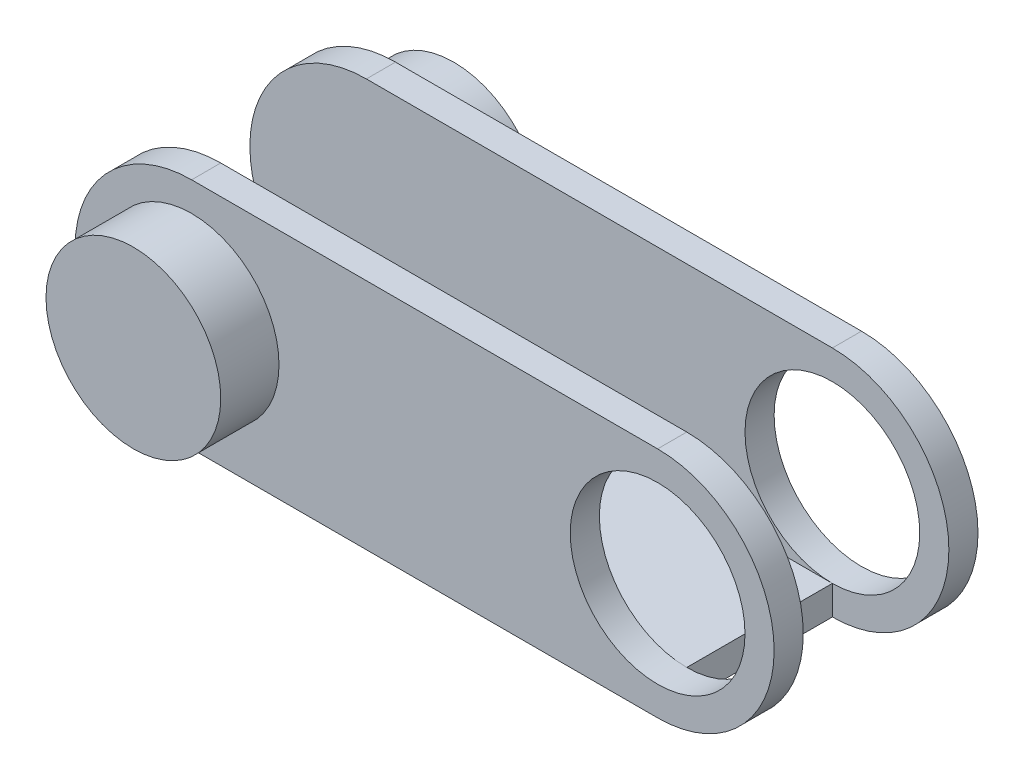
ISO-10303-21;
HEADER;
FILE_DESCRIPTION(('STEP AP214'),'2;1');
FILE_NAME('part.step','',(''),(''),'','','');
FILE_SCHEMA(('AUTOMOTIVE_DESIGN { 1 0 10303 214 1 1 1 1 }'));
ENDSEC;
DATA;
#1=APPLICATION_CONTEXT('core data for automotive mechanical design processes');
#2=APPLICATION_PROTOCOL_DEFINITION('international standard','automotive_design',2000,#1);
#3=PRODUCT_CONTEXT('',#1,'mechanical');
#4=PRODUCT('Part','Part','',(#3));
#5=PRODUCT_RELATED_PRODUCT_CATEGORY('part','',(#4));
#6=PRODUCT_DEFINITION_FORMATION('','',#4);
#7=PRODUCT_DEFINITION_CONTEXT('part definition',#1,'design');
#8=PRODUCT_DEFINITION('design','',#6,#7);
#9=PRODUCT_DEFINITION_SHAPE('','',#8);
#10=(LENGTH_UNIT() NAMED_UNIT(*) SI_UNIT(.MILLI.,.METRE.));
#11=(NAMED_UNIT(*) PLANE_ANGLE_UNIT() SI_UNIT($,.RADIAN.));
#12=(NAMED_UNIT(*) SI_UNIT($,.STERADIAN.) SOLID_ANGLE_UNIT());
#13=UNCERTAINTY_MEASURE_WITH_UNIT(LENGTH_MEASURE(1.E-05),#10,'distance_accuracy_value','');
#14=(GEOMETRIC_REPRESENTATION_CONTEXT(3) GLOBAL_UNCERTAINTY_ASSIGNED_CONTEXT((#13)) GLOBAL_UNIT_ASSIGNED_CONTEXT((#10,
#11,#12)) REPRESENTATION_CONTEXT('',''));
#15=CARTESIAN_POINT('',(0.,0.,0.));
#16=DIRECTION('',(0.,0.,1.));
#17=DIRECTION('',(1.,0.,0.));
#18=AXIS2_PLACEMENT_3D('',#15,#16,#17);
#19=CARTESIAN_POINT('',(0.,-30.,0.));
#20=DIRECTION('',(1.,0.,0.));
#21=DIRECTION('',(0.,1.,0.));
#22=AXIS2_PLACEMENT_3D('',#19,#20,#21);
#23=PLANE('',#22);
#24=DIRECTION('',(0.,0.,1.));
#25=VECTOR('',#24,1.);
#26=CARTESIAN_POINT('',(0.,-40.,0.));
#27=LINE('',#26,#25);
#28=CARTESIAN_POINT('',(0.,-40.,-50.));
#29=VERTEX_POINT('',#28);
#30=CARTESIAN_POINT('',(0.,-40.,0.));
#31=VERTEX_POINT('',#30);
#32=EDGE_CURVE('E145',#29,#31,#27,.T.);
#33=ORIENTED_EDGE('',*,*,#32,.F.);
#34=DIRECTION('',(0.,1.,0.));
#35=VECTOR('',#34,1.);
#36=CARTESIAN_POINT('',(0.,-30.,-50.));
#37=LINE('',#36,#35);
#38=CARTESIAN_POINT('',(0.,-30.,-50.));
#39=VERTEX_POINT('',#38);
#40=EDGE_CURVE('E222',#29,#39,#37,.T.);
#41=ORIENTED_EDGE('',*,*,#40,.T.);
#42=DIRECTION('',(0.,0.,1.));
#43=VECTOR('',#42,1.);
#44=CARTESIAN_POINT('',(0.,-30.,0.));
#45=LINE('',#44,#43);
#46=CARTESIAN_POINT('',(0.,-30.,0.));
#47=VERTEX_POINT('',#46);
#48=EDGE_CURVE('E161',#39,#47,#45,.T.);
#49=ORIENTED_EDGE('',*,*,#48,.T.);
#50=DIRECTION('',(0.,-1.,0.));
#51=VECTOR('',#50,1.);
#52=CARTESIAN_POINT('',(0.,-30.,0.));
#53=LINE('',#52,#51);
#54=EDGE_CURVE('E170',#47,#31,#53,.T.);
#55=ORIENTED_EDGE('',*,*,#54,.T.);
#56=EDGE_LOOP('',(#33,#41,#49,#55));
#57=FACE_BOUND('',#56,.T.);
#58=ADVANCED_FACE('F47',(#57),#23,.T.);
#59=CARTESIAN_POINT('',(-160.,-30.,0.));
#60=DIRECTION('',(-1.,0.,0.));
#61=DIRECTION('',(0.,-1.,0.));
#62=AXIS2_PLACEMENT_3D('',#59,#60,#61);
#63=PLANE('',#62);
#64=DIRECTION('',(0.,0.,-1.));
#65=VECTOR('',#64,1.);
#66=CARTESIAN_POINT('',(-160.,-30.,0.));
#67=LINE('',#66,#65);
#68=CARTESIAN_POINT('',(-160.,-30.,0.));
#69=VERTEX_POINT('',#68);
#70=CARTESIAN_POINT('',(-160.,-30.,-50.));
#71=VERTEX_POINT('',#70);
#72=EDGE_CURVE('E173',#69,#71,#67,.T.);
#73=ORIENTED_EDGE('',*,*,#72,.T.);
#74=DIRECTION('',(0.,-1.,0.));
#75=VECTOR('',#74,1.);
#76=CARTESIAN_POINT('',(-160.,-30.,-50.));
#77=LINE('',#76,#75);
#78=CARTESIAN_POINT('',(-160.,-40.,-50.));
#79=VERTEX_POINT('',#78);
#80=EDGE_CURVE('E62',#71,#79,#77,.T.);
#81=ORIENTED_EDGE('',*,*,#80,.T.);
#82=DIRECTION('',(0.,0.,-1.));
#83=VECTOR('',#82,1.);
#84=CARTESIAN_POINT('',(-160.,-40.,0.));
#85=LINE('',#84,#83);
#86=CARTESIAN_POINT('',(-160.,-40.,0.));
#87=VERTEX_POINT('',#86);
#88=EDGE_CURVE('E89',#87,#79,#85,.T.);
#89=ORIENTED_EDGE('',*,*,#88,.F.);
#90=DIRECTION('',(0.,-1.,0.));
#91=VECTOR('',#90,1.);
#92=CARTESIAN_POINT('',(-160.,-30.,0.));
#93=LINE('',#92,#91);
#94=EDGE_CURVE('E167',#69,#87,#93,.T.);
#95=ORIENTED_EDGE('',*,*,#94,.F.);
#96=EDGE_LOOP('',(#73,#81,#89,#95));
#97=FACE_BOUND('',#96,.T.);
#98=ADVANCED_FACE('F218',(#97),#63,.T.);
#99=CARTESIAN_POINT('',(0.,-30.,0.));
#100=DIRECTION('',(0.,1.,0.));
#101=DIRECTION('',(-1.,0.,0.));
#102=AXIS2_PLACEMENT_3D('',#99,#100,#101);
#103=PLANE('',#102);
#104=ORIENTED_EDGE('',*,*,#48,.F.);
#105=DIRECTION('',(-1.,0.,0.));
#106=VECTOR('',#105,1.);
#107=CARTESIAN_POINT('',(0.,-30.,-50.));
#108=LINE('',#107,#106);
#109=EDGE_CURVE('E55',#39,#71,#108,.T.);
#110=ORIENTED_EDGE('',*,*,#109,.T.);
#111=ORIENTED_EDGE('',*,*,#72,.F.);
#112=DIRECTION('',(-1.,0.,0.));
#113=VECTOR('',#112,1.);
#114=CARTESIAN_POINT('',(0.,-30.,0.));
#115=LINE('',#114,#113);
#116=EDGE_CURVE('E163',#47,#69,#115,.T.);
#117=ORIENTED_EDGE('',*,*,#116,.F.);
#118=EDGE_LOOP('',(#104,#110,#111,#117));
#119=FACE_BOUND('',#118,.T.);
#120=ADVANCED_FACE('F213',(#119),#103,.T.);
#121=CARTESIAN_POINT('',(0.,0.,0.));
#122=DIRECTION('',(0.,0.,1.));
#123=DIRECTION('',(1.,0.,0.));
#124=AXIS2_PLACEMENT_3D('',#121,#122,#123);
#125=PLANE('',#124);
#126=ORIENTED_EDGE('',*,*,#54,.F.);
#127=CARTESIAN_POINT('',(0.,0.,0.));
#128=DIRECTION('',(0.,0.,1.));
#129=DIRECTION('',(1.,0.,0.));
#130=AXIS2_PLACEMENT_3D('',#127,#128,#129);
#131=CIRCLE('',#130,30.);
#132=EDGE_CURVE('E177',#47,#47,#131,.T.);
#133=ORIENTED_EDGE('',*,*,#132,.T.);
#134=ORIENTED_EDGE('',*,*,#116,.T.);
#135=ORIENTED_EDGE('',*,*,#94,.T.);
#136=CARTESIAN_POINT('',(-160.,0.,0.));
#137=DIRECTION('',(0.,0.,1.));
#138=DIRECTION('',(1.,0.,0.));
#139=AXIS2_PLACEMENT_3D('',#136,#137,#138);
#140=CIRCLE('',#139,40.);
#141=CARTESIAN_POINT('',(-160.,40.,0.));
#142=VERTEX_POINT('',#141);
#143=EDGE_CURVE('E188',#142,#87,#140,.T.);
#144=ORIENTED_EDGE('',*,*,#143,.F.);
#145=DIRECTION('',(-1.,0.,0.));
#146=VECTOR('',#145,1.);
#147=CARTESIAN_POINT('',(0.,40.,0.));
#148=LINE('',#147,#146);
#149=CARTESIAN_POINT('',(0.,40.,0.));
#150=VERTEX_POINT('',#149);
#151=EDGE_CURVE('E196',#150,#142,#148,.T.);
#152=ORIENTED_EDGE('',*,*,#151,.F.);
#153=CARTESIAN_POINT('',(0.,0.,0.));
#154=DIRECTION('',(0.,0.,1.));
#155=DIRECTION('',(1.,0.,0.));
#156=AXIS2_PLACEMENT_3D('',#153,#154,#155);
#157=CIRCLE('',#156,40.);
#158=EDGE_CURVE('E183',#31,#150,#157,.T.);
#159=ORIENTED_EDGE('',*,*,#158,.F.);
#160=EDGE_LOOP('',(#126,#133,#134,#135,#144,#152,#159));
#161=FACE_BOUND('',#160,.T.);
#162=ADVANCED_FACE('F282',(#161),#125,.F.);
#163=CARTESIAN_POINT('',(0.,0.,10.));
#164=DIRECTION('',(0.,0.,1.));
#165=DIRECTION('',(1.,0.,0.));
#166=AXIS2_PLACEMENT_3D('',#163,#164,#165);
#167=PLANE('',#166);
#168=CARTESIAN_POINT('',(-160.,0.,10.));
#169=DIRECTION('',(0.,0.,1.));
#170=DIRECTION('',(1.,0.,0.));
#171=AXIS2_PLACEMENT_3D('',#168,#169,#170);
#172=CIRCLE('',#171,30.);
#173=CARTESIAN_POINT('',(-130.,0.,10.));
#174=VERTEX_POINT('',#173);
#175=EDGE_CURVE('E169',#174,#174,#172,.T.);
#176=ORIENTED_EDGE('',*,*,#175,.F.);
#177=EDGE_LOOP('',(#176));
#178=FACE_BOUND('',#177,.T.);
#179=CARTESIAN_POINT('',(0.,0.,10.));
#180=DIRECTION('',(0.,0.,1.));
#181=DIRECTION('',(1.,0.,0.));
#182=AXIS2_PLACEMENT_3D('',#179,#180,#181);
#183=CIRCLE('',#182,40.);
#184=CARTESIAN_POINT('',(0.,-40.,10.));
#185=VERTEX_POINT('',#184);
#186=CARTESIAN_POINT('',(0.,40.,10.));
#187=VERTEX_POINT('',#186);
#188=EDGE_CURVE('E186',#185,#187,#183,.T.);
#189=ORIENTED_EDGE('',*,*,#188,.T.);
#190=DIRECTION('',(-1.,0.,0.));
#191=VECTOR('',#190,1.);
#192=CARTESIAN_POINT('',(0.,40.,10.));
#193=LINE('',#192,#191);
#194=CARTESIAN_POINT('',(-160.,40.,10.));
#195=VERTEX_POINT('',#194);
#196=EDGE_CURVE('E97',#187,#195,#193,.T.);
#197=ORIENTED_EDGE('',*,*,#196,.T.);
#198=CARTESIAN_POINT('',(-160.,0.,10.));
#199=DIRECTION('',(0.,0.,1.));
#200=DIRECTION('',(1.,0.,0.));
#201=AXIS2_PLACEMENT_3D('',#198,#199,#200);
#202=CIRCLE('',#201,40.);
#203=CARTESIAN_POINT('',(-160.,-40.,10.));
#204=VERTEX_POINT('',#203);
#205=EDGE_CURVE('E190',#195,#204,#202,.T.);
#206=ORIENTED_EDGE('',*,*,#205,.T.);
#207=DIRECTION('',(1.,0.,0.));
#208=VECTOR('',#207,1.);
#209=CARTESIAN_POINT('',(0.,-40.,10.));
#210=LINE('',#209,#208);
#211=EDGE_CURVE('E71',#204,#185,#210,.T.);
#212=ORIENTED_EDGE('',*,*,#211,.T.);
#213=EDGE_LOOP('',(#189,#197,#206,#212));
#214=FACE_BOUND('',#213,.T.);
#215=CARTESIAN_POINT('',(0.,0.,10.));
#216=DIRECTION('',(0.,0.,1.));
#217=DIRECTION('',(1.,0.,0.));
#218=AXIS2_PLACEMENT_3D('',#215,#216,#217);
#219=CIRCLE('',#218,30.);
#220=CARTESIAN_POINT('',(30.,0.,10.));
#221=VERTEX_POINT('',#220);
#222=EDGE_CURVE('E180',#221,#221,#219,.T.);
#223=ORIENTED_EDGE('',*,*,#222,.F.);
#224=EDGE_LOOP('',(#223));
#225=FACE_BOUND('',#224,.T.);
#226=ADVANCED_FACE('F279',(#178,#214,#225),#167,.T.);
#227=CARTESIAN_POINT('',(0.,0.,10.));
#228=DIRECTION('',(0.,0.,-1.));
#229=DIRECTION('',(-1.,0.,0.));
#230=AXIS2_PLACEMENT_3D('',#227,#228,#229);
#231=CYLINDRICAL_SURFACE('',#230,40.);
#232=ORIENTED_EDGE('',*,*,#158,.T.);
#233=DIRECTION('',(0.,0.,-1.));
#234=VECTOR('',#233,1.);
#235=CARTESIAN_POINT('',(0.,40.,10.));
#236=LINE('',#235,#234);
#237=EDGE_CURVE('E208',#187,#150,#236,.T.);
#238=ORIENTED_EDGE('',*,*,#237,.F.);
#239=ORIENTED_EDGE('',*,*,#188,.F.);
#240=DIRECTION('',(0.,0.,-1.));
#241=VECTOR('',#240,1.);
#242=CARTESIAN_POINT('',(0.,-40.,10.));
#243=LINE('',#242,#241);
#244=EDGE_CURVE('E193',#185,#31,#243,.T.);
#245=ORIENTED_EDGE('',*,*,#244,.T.);
#246=EDGE_LOOP('',(#232,#238,#239,#245));
#247=FACE_BOUND('',#246,.T.);
#248=ADVANCED_FACE('F49',(#247),#231,.T.);
#249=CARTESIAN_POINT('',(0.,40.,10.));
#250=DIRECTION('',(0.,-1.,0.));
#251=DIRECTION('',(1.,0.,0.));
#252=AXIS2_PLACEMENT_3D('',#249,#250,#251);
#253=PLANE('',#252);
#254=ORIENTED_EDGE('',*,*,#151,.T.);
#255=DIRECTION('',(0.,0.,-1.));
#256=VECTOR('',#255,1.);
#257=CARTESIAN_POINT('',(-160.,40.,10.));
#258=LINE('',#257,#256);
#259=EDGE_CURVE('E205',#195,#142,#258,.T.);
#260=ORIENTED_EDGE('',*,*,#259,.F.);
#261=ORIENTED_EDGE('',*,*,#196,.F.);
#262=ORIENTED_EDGE('',*,*,#237,.T.);
#263=EDGE_LOOP('',(#254,#260,#261,#262));
#264=FACE_BOUND('',#263,.T.);
#265=ADVANCED_FACE('F291',(#264),#253,.F.);
#266=CARTESIAN_POINT('',(-160.,0.,10.));
#267=DIRECTION('',(0.,0.,-1.));
#268=DIRECTION('',(-1.,0.,0.));
#269=AXIS2_PLACEMENT_3D('',#266,#267,#268);
#270=CYLINDRICAL_SURFACE('',#269,40.);
#271=ORIENTED_EDGE('',*,*,#143,.T.);
#272=DIRECTION('',(0.,0.,-1.));
#273=VECTOR('',#272,1.);
#274=CARTESIAN_POINT('',(-160.,-40.,10.));
#275=LINE('',#274,#273);
#276=EDGE_CURVE('E202',#204,#87,#275,.T.);
#277=ORIENTED_EDGE('',*,*,#276,.F.);
#278=ORIENTED_EDGE('',*,*,#205,.F.);
#279=ORIENTED_EDGE('',*,*,#259,.T.);
#280=EDGE_LOOP('',(#271,#277,#278,#279));
#281=FACE_BOUND('',#280,.T.);
#282=ADVANCED_FACE('F289',(#281),#270,.T.);
#283=CARTESIAN_POINT('',(0.,-40.,10.));
#284=DIRECTION('',(0.,1.,0.));
#285=DIRECTION('',(-1.,0.,0.));
#286=AXIS2_PLACEMENT_3D('',#283,#284,#285);
#287=PLANE('',#286);
#288=CARTESIAN_POINT('',(0.,-40.,-60.));
#289=VERTEX_POINT('',#288);
#290=EDGE_CURVE('E135',#289,#29,#27,.T.);
#291=ORIENTED_EDGE('',*,*,#290,.T.);
#292=ORIENTED_EDGE('',*,*,#32,.T.);
#293=ORIENTED_EDGE('',*,*,#244,.F.);
#294=ORIENTED_EDGE('',*,*,#211,.F.);
#295=ORIENTED_EDGE('',*,*,#276,.T.);
#296=ORIENTED_EDGE('',*,*,#88,.T.);
#297=DIRECTION('',(0.,0.,1.));
#298=VECTOR('',#297,1.);
#299=CARTESIAN_POINT('',(-160.,-40.,-60.));
#300=LINE('',#299,#298);
#301=CARTESIAN_POINT('',(-160.,-40.,-60.));
#302=VERTEX_POINT('',#301);
#303=EDGE_CURVE('E160',#302,#79,#300,.T.);
#304=ORIENTED_EDGE('',*,*,#303,.F.);
#305=DIRECTION('',(1.,0.,0.));
#306=VECTOR('',#305,1.);
#307=CARTESIAN_POINT('',(0.,-40.,-60.));
#308=LINE('',#307,#306);
#309=EDGE_CURVE('E152',#302,#289,#308,.T.);
#310=ORIENTED_EDGE('',*,*,#309,.T.);
#311=EDGE_LOOP('',(#291,#292,#293,#294,#295,#296,#304,#310));
#312=FACE_BOUND('',#311,.T.);
#313=ADVANCED_FACE('F159',(#312),#287,.F.);
#314=CARTESIAN_POINT('',(0.,0.,10.));
#315=DIRECTION('',(0.,0.,-1.));
#316=DIRECTION('',(-1.,0.,0.));
#317=AXIS2_PLACEMENT_3D('',#314,#315,#316);
#318=CYLINDRICAL_SURFACE('',#317,30.);
#319=ORIENTED_EDGE('',*,*,#222,.T.);
#320=EDGE_LOOP('',(#319));
#321=FACE_BOUND('',#320,.T.);
#322=ORIENTED_EDGE('',*,*,#132,.F.);
#323=EDGE_LOOP('',(#322));
#324=FACE_BOUND('',#323,.T.);
#325=ADVANCED_FACE('F274',(#321,#324),#318,.F.);
#326=CARTESIAN_POINT('',(-160.,0.,30.));
#327=DIRECTION('',(0.,0.,-1.));
#328=DIRECTION('',(-1.,0.,0.));
#329=AXIS2_PLACEMENT_3D('',#326,#327,#328);
#330=CYLINDRICAL_SURFACE('',#329,30.);
#331=CARTESIAN_POINT('',(-160.,0.,30.));
#332=DIRECTION('',(0.,0.,1.));
#333=DIRECTION('',(1.,0.,0.));
#334=AXIS2_PLACEMENT_3D('',#331,#332,#333);
#335=CIRCLE('',#334,30.);
#336=CARTESIAN_POINT('',(-130.,0.,30.));
#337=VERTEX_POINT('',#336);
#338=EDGE_CURVE('E174',#337,#337,#335,.T.);
#339=ORIENTED_EDGE('',*,*,#338,.F.);
#340=EDGE_LOOP('',(#339));
#341=FACE_BOUND('',#340,.T.);
#342=ORIENTED_EDGE('',*,*,#175,.T.);
#343=EDGE_LOOP('',(#342));
#344=FACE_BOUND('',#343,.T.);
#345=ADVANCED_FACE('F270',(#341,#344),#330,.T.);
#346=CARTESIAN_POINT('',(-160.,0.,30.));
#347=DIRECTION('',(0.,0.,1.));
#348=DIRECTION('',(1.,0.,0.));
#349=AXIS2_PLACEMENT_3D('',#346,#347,#348);
#350=PLANE('',#349);
#351=ORIENTED_EDGE('',*,*,#338,.T.);
#352=EDGE_LOOP('',(#351));
#353=FACE_BOUND('',#352,.T.);
#354=ADVANCED_FACE('F267',(#353),#350,.T.);
#355=CARTESIAN_POINT('',(0.,-30.,-60.));
#356=DIRECTION('',(0.,0.,-1.));
#357=DIRECTION('',(-1.,0.,0.));
#358=AXIS2_PLACEMENT_3D('',#355,#356,#357);
#359=PLANE('',#358);
#360=CARTESIAN_POINT('',(-160.,0.,-60.));
#361=DIRECTION('',(0.,0.,-1.));
#362=DIRECTION('',(-1.,0.,0.));
#363=AXIS2_PLACEMENT_3D('',#360,#361,#362);
#364=CIRCLE('',#363,30.);
#365=CARTESIAN_POINT('',(-190.,0.,-60.));
#366=VERTEX_POINT('',#365);
#367=EDGE_CURVE('E11',#366,#366,#364,.T.);
#368=ORIENTED_EDGE('',*,*,#367,.F.);
#369=EDGE_LOOP('',(#368));
#370=FACE_BOUND('',#369,.T.);
#371=CARTESIAN_POINT('',(0.,0.,-60.));
#372=DIRECTION('',(0.,0.,1.));
#373=DIRECTION('',(1.,0.,0.));
#374=AXIS2_PLACEMENT_3D('',#371,#372,#373);
#375=CIRCLE('',#374,40.);
#376=CARTESIAN_POINT('',(0.,40.,-60.));
#377=VERTEX_POINT('',#376);
#378=EDGE_CURVE('E138',#289,#377,#375,.T.);
#379=ORIENTED_EDGE('',*,*,#378,.F.);
#380=ORIENTED_EDGE('',*,*,#309,.F.);
#381=CARTESIAN_POINT('',(-160.,0.,-60.));
#382=DIRECTION('',(0.,0.,1.));
#383=DIRECTION('',(1.,0.,0.));
#384=AXIS2_PLACEMENT_3D('',#381,#382,#383);
#385=CIRCLE('',#384,40.);
#386=CARTESIAN_POINT('',(-160.,40.,-60.));
#387=VERTEX_POINT('',#386);
#388=EDGE_CURVE('E155',#387,#302,#385,.T.);
#389=ORIENTED_EDGE('',*,*,#388,.F.);
#390=DIRECTION('',(-1.,0.,0.));
#391=VECTOR('',#390,1.);
#392=CARTESIAN_POINT('',(0.,40.,-60.));
#393=LINE('',#392,#391);
#394=EDGE_CURVE('E154',#377,#387,#393,.T.);
#395=ORIENTED_EDGE('',*,*,#394,.F.);
#396=EDGE_LOOP('',(#379,#380,#389,#395));
#397=FACE_BOUND('',#396,.T.);
#398=CARTESIAN_POINT('',(0.,0.,-60.));
#399=DIRECTION('',(0.,0.,1.));
#400=DIRECTION('',(1.,0.,0.));
#401=AXIS2_PLACEMENT_3D('',#398,#399,#400);
#402=CIRCLE('',#401,30.);
#403=CARTESIAN_POINT('',(30.,0.,-60.));
#404=VERTEX_POINT('',#403);
#405=EDGE_CURVE('E236',#404,#404,#402,.T.);
#406=ORIENTED_EDGE('',*,*,#405,.T.);
#407=EDGE_LOOP('',(#406));
#408=FACE_BOUND('',#407,.T.);
#409=ADVANCED_FACE('F149',(#370,#397,#408),#359,.T.);
#410=CARTESIAN_POINT('',(0.,0.,-60.));
#411=DIRECTION('',(0.,0.,1.));
#412=DIRECTION('',(1.,0.,0.));
#413=AXIS2_PLACEMENT_3D('',#410,#411,#412);
#414=CYLINDRICAL_SURFACE('',#413,40.);
#415=CARTESIAN_POINT('',(0.,0.,-50.));
#416=DIRECTION('',(0.,0.,1.));
#417=DIRECTION('',(1.,0.,0.));
#418=AXIS2_PLACEMENT_3D('',#415,#416,#417);
#419=CIRCLE('',#418,40.);
#420=CARTESIAN_POINT('',(0.,40.,-50.));
#421=VERTEX_POINT('',#420);
#422=EDGE_CURVE('E141',#29,#421,#419,.T.);
#423=ORIENTED_EDGE('',*,*,#422,.F.);
#424=ORIENTED_EDGE('',*,*,#290,.F.);
#425=ORIENTED_EDGE('',*,*,#378,.T.);
#426=DIRECTION('',(0.,0.,1.));
#427=VECTOR('',#426,1.);
#428=CARTESIAN_POINT('',(0.,40.,-60.));
#429=LINE('',#428,#427);
#430=EDGE_CURVE('E229',#377,#421,#429,.T.);
#431=ORIENTED_EDGE('',*,*,#430,.T.);
#432=EDGE_LOOP('',(#423,#424,#425,#431));
#433=FACE_BOUND('',#432,.T.);
#434=ADVANCED_FACE('F137',(#433),#414,.T.);
#435=CARTESIAN_POINT('',(-160.,0.,-60.));
#436=DIRECTION('',(0.,0.,1.));
#437=DIRECTION('',(1.,0.,0.));
#438=AXIS2_PLACEMENT_3D('',#435,#436,#437);
#439=CYLINDRICAL_SURFACE('',#438,40.);
#440=CARTESIAN_POINT('',(-160.,0.,-50.));
#441=DIRECTION('',(0.,0.,1.));
#442=DIRECTION('',(1.,0.,0.));
#443=AXIS2_PLACEMENT_3D('',#440,#441,#442);
#444=CIRCLE('',#443,40.);
#445=CARTESIAN_POINT('',(-160.,40.,-50.));
#446=VERTEX_POINT('',#445);
#447=EDGE_CURVE('E233',#446,#79,#444,.T.);
#448=ORIENTED_EDGE('',*,*,#447,.F.);
#449=DIRECTION('',(0.,0.,1.));
#450=VECTOR('',#449,1.);
#451=CARTESIAN_POINT('',(-160.,40.,-60.));
#452=LINE('',#451,#450);
#453=EDGE_CURVE('E227',#387,#446,#452,.T.);
#454=ORIENTED_EDGE('',*,*,#453,.F.);
#455=ORIENTED_EDGE('',*,*,#388,.T.);
#456=ORIENTED_EDGE('',*,*,#303,.T.);
#457=EDGE_LOOP('',(#448,#454,#455,#456));
#458=FACE_BOUND('',#457,.T.);
#459=ADVANCED_FACE('F321',(#458),#439,.T.);
#460=CARTESIAN_POINT('',(0.,40.,-60.));
#461=DIRECTION('',(0.,1.,0.));
#462=DIRECTION('',(-1.,0.,0.));
#463=AXIS2_PLACEMENT_3D('',#460,#461,#462);
#464=PLANE('',#463);
#465=DIRECTION('',(-1.,0.,0.));
#466=VECTOR('',#465,1.);
#467=CARTESIAN_POINT('',(0.,40.,-50.));
#468=LINE('',#467,#466);
#469=EDGE_CURVE('E156',#421,#446,#468,.T.);
#470=ORIENTED_EDGE('',*,*,#469,.F.);
#471=ORIENTED_EDGE('',*,*,#430,.F.);
#472=ORIENTED_EDGE('',*,*,#394,.T.);
#473=ORIENTED_EDGE('',*,*,#453,.T.);
#474=EDGE_LOOP('',(#470,#471,#472,#473));
#475=FACE_BOUND('',#474,.T.);
#476=ADVANCED_FACE('F329',(#475),#464,.T.);
#477=CARTESIAN_POINT('',(0.,0.,-50.));
#478=DIRECTION('',(0.,0.,-1.));
#479=DIRECTION('',(1.,0.,0.));
#480=AXIS2_PLACEMENT_3D('',#477,#478,#479);
#481=PLANE('',#480);
#482=ORIENTED_EDGE('',*,*,#40,.F.);
#483=ORIENTED_EDGE('',*,*,#422,.T.);
#484=ORIENTED_EDGE('',*,*,#469,.T.);
#485=ORIENTED_EDGE('',*,*,#447,.T.);
#486=ORIENTED_EDGE('',*,*,#80,.F.);
#487=ORIENTED_EDGE('',*,*,#109,.F.);
#488=CARTESIAN_POINT('',(0.,0.,-50.));
#489=DIRECTION('',(0.,0.,1.));
#490=DIRECTION('',(1.,0.,0.));
#491=AXIS2_PLACEMENT_3D('',#488,#489,#490);
#492=CIRCLE('',#491,30.);
#493=EDGE_CURVE('E239',#39,#39,#492,.T.);
#494=ORIENTED_EDGE('',*,*,#493,.F.);
#495=EDGE_LOOP('',(#482,#483,#484,#485,#486,#487,#494));
#496=FACE_BOUND('',#495,.T.);
#497=ADVANCED_FACE('F309',(#496),#481,.F.);
#498=CARTESIAN_POINT('',(0.,0.,-60.));
#499=DIRECTION('',(0.,0.,1.));
#500=DIRECTION('',(1.,0.,0.));
#501=AXIS2_PLACEMENT_3D('',#498,#499,#500);
#502=CYLINDRICAL_SURFACE('',#501,30.);
#503=ORIENTED_EDGE('',*,*,#493,.T.);
#504=EDGE_LOOP('',(#503));
#505=FACE_BOUND('',#504,.T.);
#506=ORIENTED_EDGE('',*,*,#405,.F.);
#507=EDGE_LOOP('',(#506));
#508=FACE_BOUND('',#507,.T.);
#509=ADVANCED_FACE('F256',(#505,#508),#502,.F.);
#510=CARTESIAN_POINT('',(-160.,0.,-80.));
#511=DIRECTION('',(0.,0.,1.));
#512=DIRECTION('',(1.,0.,0.));
#513=AXIS2_PLACEMENT_3D('',#510,#511,#512);
#514=CYLINDRICAL_SURFACE('',#513,30.);
#515=CARTESIAN_POINT('',(-160.,0.,-80.));
#516=DIRECTION('',(0.,0.,1.));
#517=DIRECTION('',(1.,0.,0.));
#518=AXIS2_PLACEMENT_3D('',#515,#516,#517);
#519=CIRCLE('',#518,30.);
#520=CARTESIAN_POINT('',(-130.,0.,-80.));
#521=VERTEX_POINT('',#520);
#522=EDGE_CURVE('E241',#521,#521,#519,.T.);
#523=ORIENTED_EDGE('',*,*,#522,.T.);
#524=EDGE_LOOP('',(#523));
#525=FACE_BOUND('',#524,.T.);
#526=ORIENTED_EDGE('',*,*,#367,.T.);
#527=EDGE_LOOP('',(#526));
#528=FACE_BOUND('',#527,.T.);
#529=ADVANCED_FACE('F247',(#525,#528),#514,.T.);
#530=CARTESIAN_POINT('',(-160.,0.,-80.));
#531=DIRECTION('',(0.,0.,-1.));
#532=DIRECTION('',(1.,0.,0.));
#533=AXIS2_PLACEMENT_3D('',#530,#531,#532);
#534=PLANE('',#533);
#535=ORIENTED_EDGE('',*,*,#522,.F.);
#536=EDGE_LOOP('',(#535));
#537=FACE_BOUND('',#536,.T.);
#538=ADVANCED_FACE('F250',(#537),#534,.T.);
#539=CLOSED_SHELL('',(#58,#98,#120,#162,#226,#248,#265,#282,#313,#325,#345,#354,#409,#434,#459,
#476,#497,#509,#529,#538));
#540=MANIFOLD_SOLID_BREP('B2',#539);
#541=ADVANCED_BREP_SHAPE_REPRESENTATION('',(#18,#540),#14);
#542=SHAPE_DEFINITION_REPRESENTATION(#9,#541);
ENDSEC;
END-ISO-10303-21;
